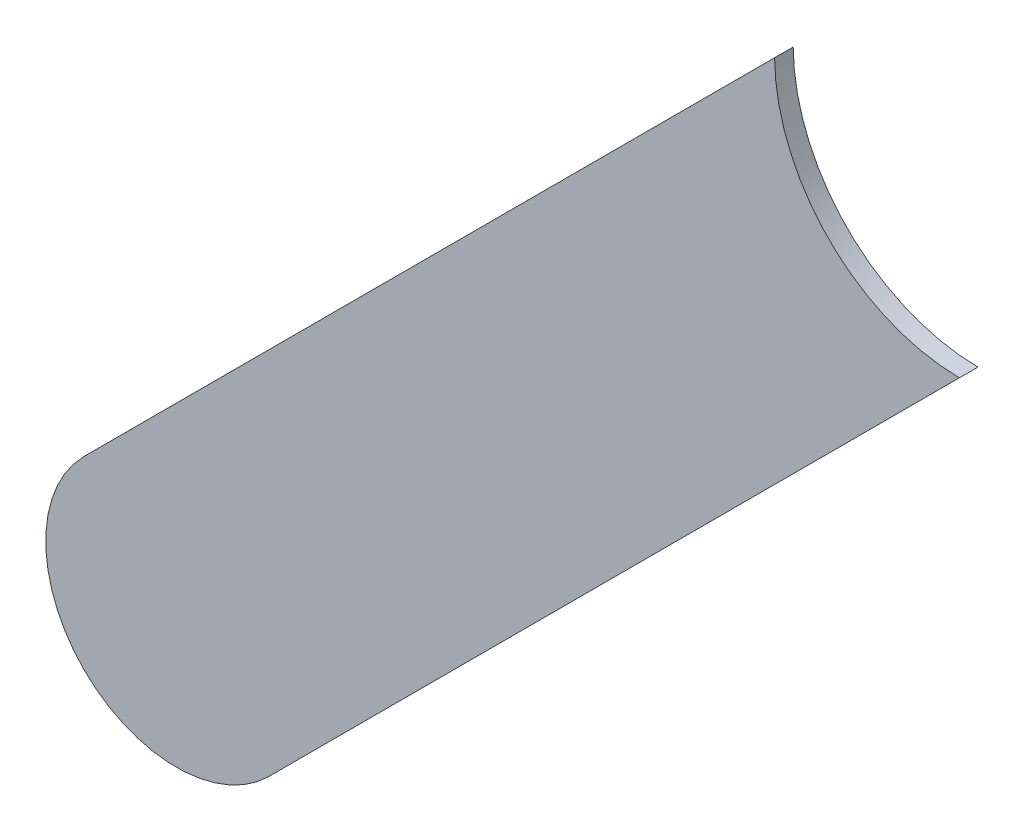
ISO-10303-21;
HEADER;
FILE_DESCRIPTION(('STEP AP214'),'2;1');
FILE_NAME('part.step','',(''),(''),'','','');
FILE_SCHEMA(('AUTOMOTIVE_DESIGN { 1 0 10303 214 1 1 1 1 }'));
ENDSEC;
DATA;
#1=APPLICATION_CONTEXT('core data for automotive mechanical design processes');
#2=APPLICATION_PROTOCOL_DEFINITION('international standard','automotive_design',2000,#1);
#3=PRODUCT_CONTEXT('',#1,'mechanical');
#4=PRODUCT('Part','Part','',(#3));
#5=PRODUCT_RELATED_PRODUCT_CATEGORY('part','',(#4));
#6=PRODUCT_DEFINITION_FORMATION('','',#4);
#7=PRODUCT_DEFINITION_CONTEXT('part definition',#1,'design');
#8=PRODUCT_DEFINITION('design','',#6,#7);
#9=PRODUCT_DEFINITION_SHAPE('','',#8);
#10=(LENGTH_UNIT() NAMED_UNIT(*) SI_UNIT(.MILLI.,.METRE.));
#11=(NAMED_UNIT(*) PLANE_ANGLE_UNIT() SI_UNIT($,.RADIAN.));
#12=(NAMED_UNIT(*) SI_UNIT($,.STERADIAN.) SOLID_ANGLE_UNIT());
#13=UNCERTAINTY_MEASURE_WITH_UNIT(LENGTH_MEASURE(1.E-05),#10,'distance_accuracy_value','');
#14=(GEOMETRIC_REPRESENTATION_CONTEXT(3) GLOBAL_UNCERTAINTY_ASSIGNED_CONTEXT((#13)) GLOBAL_UNIT_ASSIGNED_CONTEXT((#10,
#11,#12)) REPRESENTATION_CONTEXT('',''));
#15=CARTESIAN_POINT('',(0.,0.,0.));
#16=DIRECTION('',(0.,0.,1.));
#17=DIRECTION('',(1.,0.,0.));
#18=AXIS2_PLACEMENT_3D('',#15,#16,#17);
#19=CARTESIAN_POINT('',(84.57677522,93.82322358,0.));
#20=DIRECTION('',(-0.707106781186548,0.707106781186548,0.));
#21=DIRECTION('',(0.707106781186548,0.707106781186548,0.));
#22=AXIS2_PLACEMENT_3D('',#19,#20,#21);
#23=PLANE('',#22);
#24=DIRECTION('',(0.707106781186548,0.707106781186548,0.));
#25=VECTOR('',#24,1.);
#26=CARTESIAN_POINT('',(84.57677522,93.82322358,0.03556));
#27=LINE('',#26,#25);
#28=CARTESIAN_POINT('',(84.57677522,93.82322358,0.03556));
#29=VERTEX_POINT('',#28);
#30=CARTESIAN_POINT('',(85.8979570139964,95.1444053739964,0.03556));
#31=VERTEX_POINT('',#30);
#32=EDGE_CURVE('E11',#29,#31,#27,.T.);
#33=ORIENTED_EDGE('',*,*,#32,.F.);
#34=DIRECTION('',(0.,0.,1.));
#35=VECTOR('',#34,1.);
#36=CARTESIAN_POINT('',(84.57677522,93.82322358,0.));
#37=LINE('',#36,#35);
#38=CARTESIAN_POINT('',(84.57677522,93.82322358,0.));
#39=VERTEX_POINT('',#38);
#40=EDGE_CURVE('E24',#39,#29,#37,.T.);
#41=ORIENTED_EDGE('',*,*,#40,.F.);
#42=DIRECTION('',(0.707106781186548,0.707106781186548,0.));
#43=VECTOR('',#42,1.);
#44=CARTESIAN_POINT('',(84.57677522,93.82322358,0.));
#45=LINE('',#44,#43);
#46=CARTESIAN_POINT('',(85.8979570139964,95.1444053739964,0.));
#47=VERTEX_POINT('',#46);
#48=EDGE_CURVE('E75',#39,#47,#45,.T.);
#49=ORIENTED_EDGE('',*,*,#48,.T.);
#50=DIRECTION('',(0.,0.,1.));
#51=VECTOR('',#50,1.);
#52=CARTESIAN_POINT('',(85.8979570139964,95.1444053739964,0.));
#53=LINE('',#52,#51);
#54=EDGE_CURVE('E37',#47,#31,#53,.T.);
#55=ORIENTED_EDGE('',*,*,#54,.T.);
#56=EDGE_LOOP('',(#33,#41,#49,#55));
#57=FACE_BOUND('',#56,.T.);
#58=ADVANCED_FACE('F17',(#57),#23,.F.);
#59=CARTESIAN_POINT('',(85.90000092,95.4999995,0.));
#60=DIRECTION('',(0.,0.,-1.));
#61=DIRECTION('',(1.,0.,0.));
#62=AXIS2_PLACEMENT_3D('',#59,#60,#61);
#63=CYLINDRICAL_SURFACE('',#62,0.3556);
#64=DIRECTION('',(0.,0.,1.));
#65=VECTOR('',#64,1.);
#66=CARTESIAN_POINT('',(85.5444067649998,95.4979606449998,0.));
#67=LINE('',#66,#65);
#68=CARTESIAN_POINT('',(85.5444067649998,95.4979606449998,0.));
#69=VERTEX_POINT('',#68);
#70=CARTESIAN_POINT('',(85.5444067649998,95.4979606449998,0.03556));
#71=VERTEX_POINT('',#70);
#72=EDGE_CURVE('E67',#69,#71,#67,.T.);
#73=ORIENTED_EDGE('',*,*,#72,.T.);
#74=CARTESIAN_POINT('',(85.90000092,95.4999995,0.03556));
#75=DIRECTION('',(0.,0.,1.));
#76=DIRECTION('',(1.,0.,0.));
#77=AXIS2_PLACEMENT_3D('',#74,#75,#76);
#78=CIRCLE('',#77,0.3556);
#79=EDGE_CURVE('E82',#71,#31,#78,.T.);
#80=ORIENTED_EDGE('',*,*,#79,.T.);
#81=ORIENTED_EDGE('',*,*,#54,.F.);
#82=CARTESIAN_POINT('',(85.90000092,95.4999995,0.));
#83=DIRECTION('',(0.,0.,1.));
#84=DIRECTION('',(1.,0.,0.));
#85=AXIS2_PLACEMENT_3D('',#82,#83,#84);
#86=CIRCLE('',#85,0.3556);
#87=EDGE_CURVE('E80',#69,#47,#86,.T.);
#88=ORIENTED_EDGE('',*,*,#87,.F.);
#89=EDGE_LOOP('',(#73,#80,#81,#88));
#90=FACE_BOUND('',#89,.T.);
#91=ADVANCED_FACE('F88',(#90),#63,.F.);
#92=CARTESIAN_POINT('',(85.5444067649998,95.4979606449998,0.));
#93=DIRECTION('',(0.707106781186551,-0.707106781186544,0.));
#94=DIRECTION('',(-0.707106781186544,-0.707106781186551,0.));
#95=AXIS2_PLACEMENT_3D('',#92,#93,#94);
#96=PLANE('',#95);
#97=DIRECTION('',(-0.707106781186544,-0.707106781186551,0.));
#98=VECTOR('',#97,1.);
#99=CARTESIAN_POINT('',(85.723222,95.67677588,0.03556));
#100=LINE('',#99,#98);
#101=CARTESIAN_POINT('',(84.22322246,94.17677634,0.03556));
#102=VERTEX_POINT('',#101);
#103=EDGE_CURVE('E71',#71,#102,#100,.T.);
#104=ORIENTED_EDGE('',*,*,#103,.F.);
#105=ORIENTED_EDGE('',*,*,#72,.F.);
#106=DIRECTION('',(-0.707106781186544,-0.707106781186551,0.));
#107=VECTOR('',#106,1.);
#108=CARTESIAN_POINT('',(85.723222,95.67677588,0.));
#109=LINE('',#108,#107);
#110=CARTESIAN_POINT('',(84.22322246,94.17677634,0.));
#111=VERTEX_POINT('',#110);
#112=EDGE_CURVE('E63',#69,#111,#109,.T.);
#113=ORIENTED_EDGE('',*,*,#112,.T.);
#114=DIRECTION('',(0.,0.,1.));
#115=VECTOR('',#114,1.);
#116=CARTESIAN_POINT('',(84.22322246,94.17677634,0.));
#117=LINE('',#116,#115);
#118=EDGE_CURVE('E53',#111,#102,#117,.T.);
#119=ORIENTED_EDGE('',*,*,#118,.T.);
#120=EDGE_LOOP('',(#104,#105,#113,#119));
#121=FACE_BOUND('',#120,.T.);
#122=ADVANCED_FACE('F66',(#121),#96,.F.);
#123=CARTESIAN_POINT('',(84.39999884,93.99999996,0.));
#124=DIRECTION('',(0.,0.,-1.));
#125=DIRECTION('',(-0.707106781186548,0.707106781186548,0.));
#126=AXIS2_PLACEMENT_3D('',#123,#124,#125);
#127=CYLINDRICAL_SURFACE('',#126,0.24999955410322);
#128=CARTESIAN_POINT('',(84.39999884,93.99999996,0.03556));
#129=DIRECTION('',(0.,0.,1.));
#130=DIRECTION('',(-0.707106781186548,0.707106781186548,0.));
#131=AXIS2_PLACEMENT_3D('',#128,#129,#130);
#132=CIRCLE('',#131,0.24999955410322);
#133=EDGE_CURVE('E59',#102,#29,#132,.T.);
#134=ORIENTED_EDGE('',*,*,#133,.F.);
#135=ORIENTED_EDGE('',*,*,#118,.F.);
#136=CARTESIAN_POINT('',(84.39999884,93.99999996,0.));
#137=DIRECTION('',(0.,0.,1.));
#138=DIRECTION('',(-0.707106781186548,0.707106781186548,0.));
#139=AXIS2_PLACEMENT_3D('',#136,#137,#138);
#140=CIRCLE('',#139,0.24999955410322);
#141=EDGE_CURVE('E57',#111,#39,#140,.T.);
#142=ORIENTED_EDGE('',*,*,#141,.T.);
#143=ORIENTED_EDGE('',*,*,#40,.T.);
#144=EDGE_LOOP('',(#134,#135,#142,#143));
#145=FACE_BOUND('',#144,.T.);
#146=ADVANCED_FACE('F55',(#145),#127,.T.);
#147=CARTESIAN_POINT('',(84.57677522,93.82322358,0.));
#148=DIRECTION('',(0.,0.,-1.));
#149=DIRECTION('',(-1.,0.,0.));
#150=AXIS2_PLACEMENT_3D('',#147,#148,#149);
#151=PLANE('',#150);
#152=ORIENTED_EDGE('',*,*,#48,.F.);
#153=ORIENTED_EDGE('',*,*,#141,.F.);
#154=ORIENTED_EDGE('',*,*,#112,.F.);
#155=ORIENTED_EDGE('',*,*,#87,.T.);
#156=EDGE_LOOP('',(#152,#153,#154,#155));
#157=FACE_BOUND('',#156,.T.);
#158=ADVANCED_FACE('F74',(#157),#151,.T.);
#159=CARTESIAN_POINT('',(84.57677522,93.82322358,0.03556));
#160=DIRECTION('',(0.,0.,-1.));
#161=DIRECTION('',(-1.,0.,0.));
#162=AXIS2_PLACEMENT_3D('',#159,#160,#161);
#163=PLANE('',#162);
#164=ORIENTED_EDGE('',*,*,#133,.T.);
#165=ORIENTED_EDGE('',*,*,#32,.T.);
#166=ORIENTED_EDGE('',*,*,#79,.F.);
#167=ORIENTED_EDGE('',*,*,#103,.T.);
#168=EDGE_LOOP('',(#164,#165,#166,#167));
#169=FACE_BOUND('',#168,.T.);
#170=ADVANCED_FACE('F91',(#169),#163,.F.);
#171=CLOSED_SHELL('',(#58,#91,#122,#146,#158,#170));
#172=MANIFOLD_SOLID_BREP('B1',#171);
#173=ADVANCED_BREP_SHAPE_REPRESENTATION('',(#18,#172),#14);
#174=SHAPE_DEFINITION_REPRESENTATION(#9,#173);
ENDSEC;
END-ISO-10303-21;
